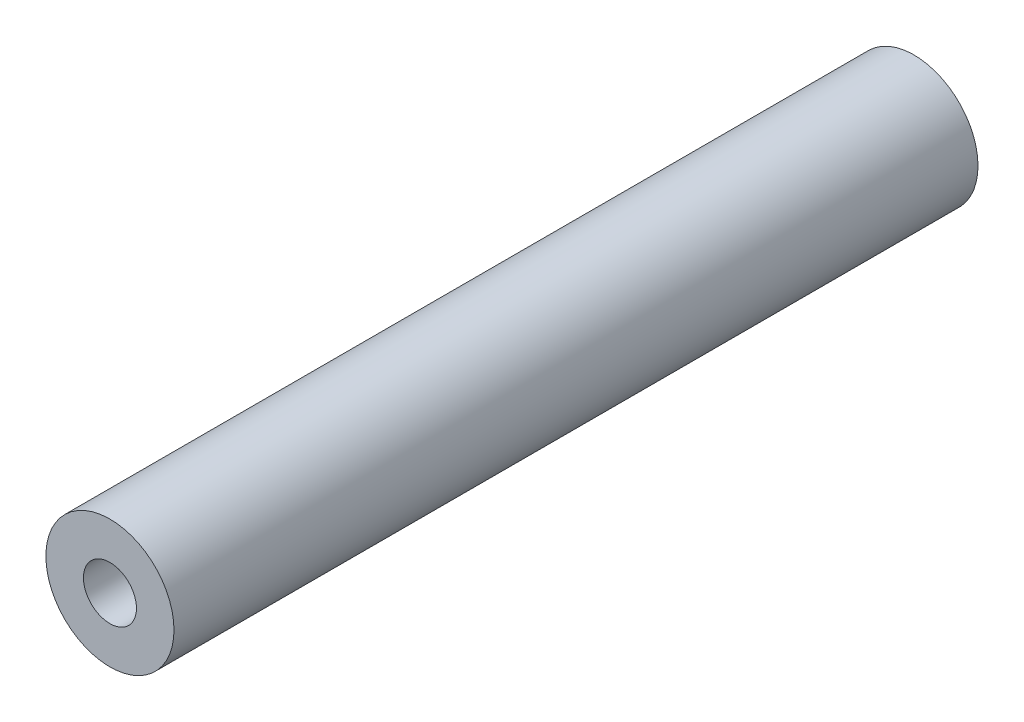
ISO-10303-21;
HEADER;
FILE_DESCRIPTION(('STEP AP214'),'2;1');
FILE_NAME('part.step','',(''),(''),'','','');
FILE_SCHEMA(('AUTOMOTIVE_DESIGN { 1 0 10303 214 1 1 1 1 }'));
ENDSEC;
DATA;
#1=APPLICATION_CONTEXT('core data for automotive mechanical design processes');
#2=APPLICATION_PROTOCOL_DEFINITION('international standard','automotive_design',2000,#1);
#3=PRODUCT_CONTEXT('',#1,'mechanical');
#4=PRODUCT('Part','Part','',(#3));
#5=PRODUCT_RELATED_PRODUCT_CATEGORY('part','',(#4));
#6=PRODUCT_DEFINITION_FORMATION('','',#4);
#7=PRODUCT_DEFINITION_CONTEXT('part definition',#1,'design');
#8=PRODUCT_DEFINITION('design','',#6,#7);
#9=PRODUCT_DEFINITION_SHAPE('','',#8);
#10=(LENGTH_UNIT() NAMED_UNIT(*) SI_UNIT(.MILLI.,.METRE.));
#11=(NAMED_UNIT(*) PLANE_ANGLE_UNIT() SI_UNIT($,.RADIAN.));
#12=(NAMED_UNIT(*) SI_UNIT($,.STERADIAN.) SOLID_ANGLE_UNIT());
#13=UNCERTAINTY_MEASURE_WITH_UNIT(LENGTH_MEASURE(1.E-05),#10,'distance_accuracy_value','');
#14=(GEOMETRIC_REPRESENTATION_CONTEXT(3) GLOBAL_UNCERTAINTY_ASSIGNED_CONTEXT((#13)) GLOBAL_UNIT_ASSIGNED_CONTEXT((#10,
#11,#12)) REPRESENTATION_CONTEXT('',''));
#15=CARTESIAN_POINT('',(0.,0.,0.));
#16=DIRECTION('',(0.,0.,1.));
#17=DIRECTION('',(1.,0.,0.));
#18=AXIS2_PLACEMENT_3D('',#15,#16,#17);
#19=CARTESIAN_POINT('',(0.,0.,92.456));
#20=DIRECTION('',(0.,0.,1.));
#21=DIRECTION('',(1.,0.,0.));
#22=AXIS2_PLACEMENT_3D('',#19,#20,#21);
#23=PLANE('',#22);
#24=CARTESIAN_POINT('',(0.,0.,92.456));
#25=DIRECTION('',(0.,0.,1.));
#26=DIRECTION('',(1.,0.,0.));
#27=AXIS2_PLACEMENT_3D('',#24,#25,#26);
#28=CIRCLE('',#27,7.366);
#29=CARTESIAN_POINT('',(7.366,0.,92.456));
#30=VERTEX_POINT('',#29);
#31=EDGE_CURVE('E10',#30,#30,#28,.T.);
#32=ORIENTED_EDGE('',*,*,#31,.T.);
#33=EDGE_LOOP('',(#32));
#34=FACE_BOUND('',#33,.T.);
#35=CARTESIAN_POINT('',(0.,0.,92.456));
#36=DIRECTION('',(0.,0.,1.));
#37=DIRECTION('',(1.,0.,0.));
#38=AXIS2_PLACEMENT_3D('',#35,#36,#37);
#39=CIRCLE('',#38,3.048);
#40=CARTESIAN_POINT('',(3.048,0.,92.456));
#41=VERTEX_POINT('',#40);
#42=EDGE_CURVE('E50',#41,#41,#39,.T.);
#43=ORIENTED_EDGE('',*,*,#42,.F.);
#44=EDGE_LOOP('',(#43));
#45=FACE_BOUND('',#44,.T.);
#46=ADVANCED_FACE('F39',(#34,#45),#23,.T.);
#47=CARTESIAN_POINT('',(0.,0.,0.));
#48=DIRECTION('',(0.,0.,1.));
#49=DIRECTION('',(1.,0.,0.));
#50=AXIS2_PLACEMENT_3D('',#47,#48,#49);
#51=PLANE('',#50);
#52=CARTESIAN_POINT('',(0.,0.,0.));
#53=DIRECTION('',(0.,0.,1.));
#54=DIRECTION('',(1.,0.,0.));
#55=AXIS2_PLACEMENT_3D('',#52,#53,#54);
#56=CIRCLE('',#55,7.366);
#57=CARTESIAN_POINT('',(7.366,0.,0.));
#58=VERTEX_POINT('',#57);
#59=EDGE_CURVE('E43',#58,#58,#56,.T.);
#60=ORIENTED_EDGE('',*,*,#59,.F.);
#61=EDGE_LOOP('',(#60));
#62=FACE_BOUND('',#61,.T.);
#63=CARTESIAN_POINT('',(0.,0.,0.));
#64=DIRECTION('',(0.,0.,1.));
#65=DIRECTION('',(1.,0.,0.));
#66=AXIS2_PLACEMENT_3D('',#63,#64,#65);
#67=CIRCLE('',#66,3.048);
#68=CARTESIAN_POINT('',(3.048,0.,0.));
#69=VERTEX_POINT('',#68);
#70=EDGE_CURVE('E52',#69,#69,#67,.T.);
#71=ORIENTED_EDGE('',*,*,#70,.T.);
#72=EDGE_LOOP('',(#71));
#73=FACE_BOUND('',#72,.T.);
#74=ADVANCED_FACE('F62',(#62,#73),#51,.F.);
#75=CARTESIAN_POINT('',(0.,0.,92.456));
#76=DIRECTION('',(0.,0.,-1.));
#77=DIRECTION('',(-1.,0.,0.));
#78=AXIS2_PLACEMENT_3D('',#75,#76,#77);
#79=CYLINDRICAL_SURFACE('',#78,7.366);
#80=ORIENTED_EDGE('',*,*,#31,.F.);
#81=EDGE_LOOP('',(#80));
#82=FACE_BOUND('',#81,.T.);
#83=ORIENTED_EDGE('',*,*,#59,.T.);
#84=EDGE_LOOP('',(#83));
#85=FACE_BOUND('',#84,.T.);
#86=ADVANCED_FACE('F41',(#82,#85),#79,.T.);
#87=CARTESIAN_POINT('',(0.,0.,92.456));
#88=DIRECTION('',(0.,0.,-1.));
#89=DIRECTION('',(-1.,0.,0.));
#90=AXIS2_PLACEMENT_3D('',#87,#88,#89);
#91=CYLINDRICAL_SURFACE('',#90,3.048);
#92=ORIENTED_EDGE('',*,*,#42,.T.);
#93=EDGE_LOOP('',(#92));
#94=FACE_BOUND('',#93,.T.);
#95=ORIENTED_EDGE('',*,*,#70,.F.);
#96=EDGE_LOOP('',(#95));
#97=FACE_BOUND('',#96,.T.);
#98=ADVANCED_FACE('F58',(#94,#97),#91,.F.);
#99=CLOSED_SHELL('',(#46,#74,#86,#98));
#100=MANIFOLD_SOLID_BREP('B2',#99);
#101=ADVANCED_BREP_SHAPE_REPRESENTATION('',(#18,#100),#14);
#102=SHAPE_DEFINITION_REPRESENTATION(#9,#101);
ENDSEC;
END-ISO-10303-21;
